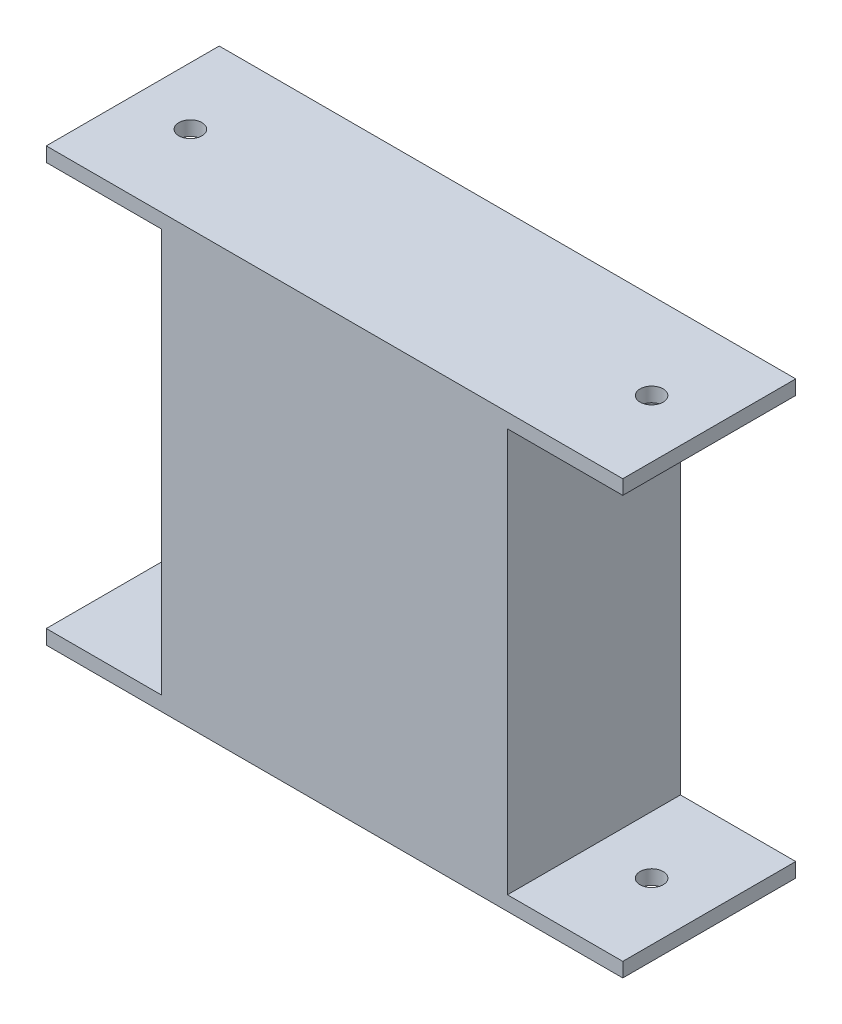
ISO-10303-21;
HEADER;
FILE_DESCRIPTION(('STEP AP214'),'2;1');
FILE_NAME('part.step','',(''),(''),'','','');
FILE_SCHEMA(('AUTOMOTIVE_DESIGN { 1 0 10303 214 1 1 1 1 }'));
ENDSEC;
DATA;
#1=APPLICATION_CONTEXT('core data for automotive mechanical design processes');
#2=APPLICATION_PROTOCOL_DEFINITION('international standard','automotive_design',2000,#1);
#3=PRODUCT_CONTEXT('',#1,'mechanical');
#4=PRODUCT('Part','Part','',(#3));
#5=PRODUCT_RELATED_PRODUCT_CATEGORY('part','',(#4));
#6=PRODUCT_DEFINITION_FORMATION('','',#4);
#7=PRODUCT_DEFINITION_CONTEXT('part definition',#1,'design');
#8=PRODUCT_DEFINITION('design','',#6,#7);
#9=PRODUCT_DEFINITION_SHAPE('','',#8);
#10=(LENGTH_UNIT() NAMED_UNIT(*) SI_UNIT(.MILLI.,.METRE.));
#11=(NAMED_UNIT(*) PLANE_ANGLE_UNIT() SI_UNIT($,.RADIAN.));
#12=(NAMED_UNIT(*) SI_UNIT($,.STERADIAN.) SOLID_ANGLE_UNIT());
#13=UNCERTAINTY_MEASURE_WITH_UNIT(LENGTH_MEASURE(1.E-05),#10,'distance_accuracy_value','');
#14=(GEOMETRIC_REPRESENTATION_CONTEXT(3) GLOBAL_UNCERTAINTY_ASSIGNED_CONTEXT((#13)) GLOBAL_UNIT_ASSIGNED_CONTEXT((#10,
#11,#12)) REPRESENTATION_CONTEXT('',''));
#15=CARTESIAN_POINT('',(0.,0.,0.));
#16=DIRECTION('',(0.,0.,1.));
#17=DIRECTION('',(1.,0.,0.));
#18=AXIS2_PLACEMENT_3D('',#15,#16,#17);
#19=CARTESIAN_POINT('',(100.,75.,60.));
#20=DIRECTION('',(-1.,0.,0.));
#21=DIRECTION('',(0.,0.,1.));
#22=AXIS2_PLACEMENT_3D('',#19,#20,#21);
#23=PLANE('',#22);
#24=DIRECTION('',(0.,1.,0.));
#25=VECTOR('',#24,1.);
#26=CARTESIAN_POINT('',(100.,75.,0.));
#27=LINE('',#26,#25);
#28=CARTESIAN_POINT('',(100.,70.,0.));
#29=VERTEX_POINT('',#28);
#30=CARTESIAN_POINT('',(100.,75.,0.));
#31=VERTEX_POINT('',#30);
#32=EDGE_CURVE('E165',#29,#31,#27,.T.);
#33=ORIENTED_EDGE('',*,*,#32,.T.);
#34=DIRECTION('',(0.,0.,-1.));
#35=VECTOR('',#34,1.);
#36=CARTESIAN_POINT('',(100.,75.,60.));
#37=LINE('',#36,#35);
#38=CARTESIAN_POINT('',(100.,75.,60.));
#39=VERTEX_POINT('',#38);
#40=EDGE_CURVE('E11',#39,#31,#37,.T.);
#41=ORIENTED_EDGE('',*,*,#40,.F.);
#42=DIRECTION('',(0.,1.,0.));
#43=VECTOR('',#42,1.);
#44=CARTESIAN_POINT('',(100.,75.,60.));
#45=LINE('',#44,#43);
#46=CARTESIAN_POINT('',(100.,70.,60.));
#47=VERTEX_POINT('',#46);
#48=EDGE_CURVE('E183',#47,#39,#45,.T.);
#49=ORIENTED_EDGE('',*,*,#48,.F.);
#50=DIRECTION('',(0.,0.,-1.));
#51=VECTOR('',#50,1.);
#52=CARTESIAN_POINT('',(100.,70.,60.));
#53=LINE('',#52,#51);
#54=EDGE_CURVE('E158',#47,#29,#53,.T.);
#55=ORIENTED_EDGE('',*,*,#54,.T.);
#56=EDGE_LOOP('',(#33,#41,#49,#55));
#57=FACE_BOUND('',#56,.T.);
#58=ADVANCED_FACE('F41',(#57),#23,.F.);
#59=CARTESIAN_POINT('',(-100.,75.,60.));
#60=DIRECTION('',(0.,-1.,0.));
#61=DIRECTION('',(0.,0.,-1.));
#62=AXIS2_PLACEMENT_3D('',#59,#60,#61);
#63=PLANE('',#62);
#64=CARTESIAN_POINT('',(-80.,75.,29.999999999999));
#65=DIRECTION('',(0.,-1.,0.));
#66=DIRECTION('',(0.,0.,-1.));
#67=AXIS2_PLACEMENT_3D('',#64,#65,#66);
#68=CIRCLE('',#67,4.00000000000001);
#69=CARTESIAN_POINT('',(-80.,75.,25.9999999999989));
#70=VERTEX_POINT('',#69);
#71=EDGE_CURVE('E167',#70,#70,#68,.T.);
#72=ORIENTED_EDGE('',*,*,#71,.T.);
#73=EDGE_LOOP('',(#72));
#74=FACE_BOUND('',#73,.T.);
#75=CARTESIAN_POINT('',(80.,75.,29.999999999999));
#76=DIRECTION('',(0.,-1.,0.));
#77=DIRECTION('',(0.,0.,-1.));
#78=AXIS2_PLACEMENT_3D('',#75,#76,#77);
#79=CIRCLE('',#78,4.00000000000001);
#80=CARTESIAN_POINT('',(80.,75.,25.9999999999989));
#81=VERTEX_POINT('',#80);
#82=EDGE_CURVE('E308',#81,#81,#79,.T.);
#83=ORIENTED_EDGE('',*,*,#82,.T.);
#84=EDGE_LOOP('',(#83));
#85=FACE_BOUND('',#84,.T.);
#86=DIRECTION('',(-1.,0.,0.));
#87=VECTOR('',#86,1.);
#88=CARTESIAN_POINT('',(-100.,75.,0.));
#89=LINE('',#88,#87);
#90=CARTESIAN_POINT('',(-100.,75.,0.));
#91=VERTEX_POINT('',#90);
#92=EDGE_CURVE('E164',#31,#91,#89,.T.);
#93=ORIENTED_EDGE('',*,*,#92,.T.);
#94=DIRECTION('',(0.,0.,-1.));
#95=VECTOR('',#94,1.);
#96=CARTESIAN_POINT('',(-100.,75.,60.));
#97=LINE('',#96,#95);
#98=CARTESIAN_POINT('',(-100.,75.,60.));
#99=VERTEX_POINT('',#98);
#100=EDGE_CURVE('E49',#99,#91,#97,.T.);
#101=ORIENTED_EDGE('',*,*,#100,.F.);
#102=DIRECTION('',(-1.,0.,0.));
#103=VECTOR('',#102,1.);
#104=CARTESIAN_POINT('',(-100.,75.,60.));
#105=LINE('',#104,#103);
#106=EDGE_CURVE('E114',#39,#99,#105,.T.);
#107=ORIENTED_EDGE('',*,*,#106,.F.);
#108=ORIENTED_EDGE('',*,*,#40,.T.);
#109=EDGE_LOOP('',(#93,#101,#107,#108));
#110=FACE_BOUND('',#109,.T.);
#111=ADVANCED_FACE('F268',(#74,#85,#110),#63,.F.);
#112=CARTESIAN_POINT('',(-100.,70.,60.));
#113=DIRECTION('',(1.,0.,0.));
#114=DIRECTION('',(0.,1.,0.));
#115=AXIS2_PLACEMENT_3D('',#112,#113,#114);
#116=PLANE('',#115);
#117=DIRECTION('',(0.,-1.,0.));
#118=VECTOR('',#117,1.);
#119=CARTESIAN_POINT('',(-100.,70.,0.));
#120=LINE('',#119,#118);
#121=CARTESIAN_POINT('',(-100.,70.,0.));
#122=VERTEX_POINT('',#121);
#123=EDGE_CURVE('E169',#91,#122,#120,.T.);
#124=ORIENTED_EDGE('',*,*,#123,.T.);
#125=DIRECTION('',(0.,0.,-1.));
#126=VECTOR('',#125,1.);
#127=CARTESIAN_POINT('',(-100.,70.,60.));
#128=LINE('',#127,#126);
#129=CARTESIAN_POINT('',(-100.,70.,60.));
#130=VERTEX_POINT('',#129);
#131=EDGE_CURVE('E204',#130,#122,#128,.T.);
#132=ORIENTED_EDGE('',*,*,#131,.F.);
#133=DIRECTION('',(0.,-1.,0.));
#134=VECTOR('',#133,1.);
#135=CARTESIAN_POINT('',(-100.,70.,60.));
#136=LINE('',#135,#134);
#137=EDGE_CURVE('E213',#99,#130,#136,.T.);
#138=ORIENTED_EDGE('',*,*,#137,.F.);
#139=ORIENTED_EDGE('',*,*,#100,.T.);
#140=EDGE_LOOP('',(#124,#132,#138,#139));
#141=FACE_BOUND('',#140,.T.);
#142=ADVANCED_FACE('F211',(#141),#116,.F.);
#143=CARTESIAN_POINT('',(-60.,70.,60.));
#144=DIRECTION('',(0.,1.,0.));
#145=DIRECTION('',(0.,0.,1.));
#146=AXIS2_PLACEMENT_3D('',#143,#144,#145);
#147=PLANE('',#146);
#148=CARTESIAN_POINT('',(-80.,70.,29.999999999999));
#149=DIRECTION('',(0.,1.,0.));
#150=DIRECTION('',(0.,0.,1.));
#151=AXIS2_PLACEMENT_3D('',#148,#149,#150);
#152=CIRCLE('',#151,4.00000000000001);
#153=CARTESIAN_POINT('',(-80.,70.,33.999999999999));
#154=VERTEX_POINT('',#153);
#155=EDGE_CURVE('E318',#154,#154,#152,.T.);
#156=ORIENTED_EDGE('',*,*,#155,.T.);
#157=EDGE_LOOP('',(#156));
#158=FACE_BOUND('',#157,.T.);
#159=DIRECTION('',(1.,0.,0.));
#160=VECTOR('',#159,1.);
#161=CARTESIAN_POINT('',(-60.,70.,0.));
#162=LINE('',#161,#160);
#163=CARTESIAN_POINT('',(-60.,70.,0.));
#164=VERTEX_POINT('',#163);
#165=EDGE_CURVE('E168',#122,#164,#162,.T.);
#166=ORIENTED_EDGE('',*,*,#165,.T.);
#167=DIRECTION('',(0.,0.,-1.));
#168=VECTOR('',#167,1.);
#169=CARTESIAN_POINT('',(-60.,70.,60.));
#170=LINE('',#169,#168);
#171=CARTESIAN_POINT('',(-60.,70.,60.));
#172=VERTEX_POINT('',#171);
#173=EDGE_CURVE('E203',#172,#164,#170,.T.);
#174=ORIENTED_EDGE('',*,*,#173,.F.);
#175=DIRECTION('',(1.,0.,0.));
#176=VECTOR('',#175,1.);
#177=CARTESIAN_POINT('',(-60.,70.,60.));
#178=LINE('',#177,#176);
#179=EDGE_CURVE('E232',#130,#172,#178,.T.);
#180=ORIENTED_EDGE('',*,*,#179,.F.);
#181=ORIENTED_EDGE('',*,*,#131,.T.);
#182=EDGE_LOOP('',(#166,#174,#180,#181));
#183=FACE_BOUND('',#182,.T.);
#184=ADVANCED_FACE('F225',(#158,#183),#147,.F.);
#185=CARTESIAN_POINT('',(-60.,-70.,60.));
#186=DIRECTION('',(1.,0.,0.));
#187=DIRECTION('',(0.,0.,-1.));
#188=AXIS2_PLACEMENT_3D('',#185,#186,#187);
#189=PLANE('',#188);
#190=DIRECTION('',(0.,-1.,0.));
#191=VECTOR('',#190,1.);
#192=CARTESIAN_POINT('',(-60.,-70.,0.));
#193=LINE('',#192,#191);
#194=CARTESIAN_POINT('',(-60.,-70.,0.));
#195=VERTEX_POINT('',#194);
#196=EDGE_CURVE('E175',#164,#195,#193,.T.);
#197=ORIENTED_EDGE('',*,*,#196,.T.);
#198=DIRECTION('',(0.,0.,-1.));
#199=VECTOR('',#198,1.);
#200=CARTESIAN_POINT('',(-60.,-70.,60.));
#201=LINE('',#200,#199);
#202=CARTESIAN_POINT('',(-60.,-70.,60.));
#203=VERTEX_POINT('',#202);
#204=EDGE_CURVE('E196',#203,#195,#201,.T.);
#205=ORIENTED_EDGE('',*,*,#204,.F.);
#206=DIRECTION('',(0.,-1.,0.));
#207=VECTOR('',#206,1.);
#208=CARTESIAN_POINT('',(-60.,-70.,60.));
#209=LINE('',#208,#207);
#210=EDGE_CURVE('E226',#172,#203,#209,.T.);
#211=ORIENTED_EDGE('',*,*,#210,.F.);
#212=ORIENTED_EDGE('',*,*,#173,.T.);
#213=EDGE_LOOP('',(#197,#205,#211,#212));
#214=FACE_BOUND('',#213,.T.);
#215=ADVANCED_FACE('F228',(#214),#189,.F.);
#216=CARTESIAN_POINT('',(-100.,-70.,60.));
#217=DIRECTION('',(0.,-1.,0.));
#218=DIRECTION('',(0.,0.,-1.));
#219=AXIS2_PLACEMENT_3D('',#216,#217,#218);
#220=PLANE('',#219);
#221=CARTESIAN_POINT('',(-80.,-70.,30.));
#222=DIRECTION('',(0.,-1.,0.));
#223=DIRECTION('',(0.,0.,-1.));
#224=AXIS2_PLACEMENT_3D('',#221,#222,#223);
#225=CIRCLE('',#224,4.00000000000001);
#226=CARTESIAN_POINT('',(-80.,-70.,26.));
#227=VERTEX_POINT('',#226);
#228=EDGE_CURVE('E310',#227,#227,#225,.T.);
#229=ORIENTED_EDGE('',*,*,#228,.T.);
#230=EDGE_LOOP('',(#229));
#231=FACE_BOUND('',#230,.T.);
#232=DIRECTION('',(-1.,0.,0.));
#233=VECTOR('',#232,1.);
#234=CARTESIAN_POINT('',(-100.,-70.,0.));
#235=LINE('',#234,#233);
#236=CARTESIAN_POINT('',(-100.,-70.,0.));
#237=VERTEX_POINT('',#236);
#238=EDGE_CURVE('E174',#195,#237,#235,.T.);
#239=ORIENTED_EDGE('',*,*,#238,.T.);
#240=DIRECTION('',(0.,0.,-1.));
#241=VECTOR('',#240,1.);
#242=CARTESIAN_POINT('',(-100.,-70.,60.));
#243=LINE('',#242,#241);
#244=CARTESIAN_POINT('',(-100.,-70.,60.));
#245=VERTEX_POINT('',#244);
#246=EDGE_CURVE('E191',#245,#237,#243,.T.);
#247=ORIENTED_EDGE('',*,*,#246,.F.);
#248=DIRECTION('',(-1.,0.,0.));
#249=VECTOR('',#248,1.);
#250=CARTESIAN_POINT('',(-100.,-70.,60.));
#251=LINE('',#250,#249);
#252=EDGE_CURVE('E227',#203,#245,#251,.T.);
#253=ORIENTED_EDGE('',*,*,#252,.F.);
#254=ORIENTED_EDGE('',*,*,#204,.T.);
#255=EDGE_LOOP('',(#239,#247,#253,#254));
#256=FACE_BOUND('',#255,.T.);
#257=ADVANCED_FACE('F287',(#231,#256),#220,.F.);
#258=CARTESIAN_POINT('',(-100.,-75.,60.));
#259=DIRECTION('',(1.,0.,0.));
#260=DIRECTION('',(0.,1.,0.));
#261=AXIS2_PLACEMENT_3D('',#258,#259,#260);
#262=PLANE('',#261);
#263=DIRECTION('',(0.,-1.,0.));
#264=VECTOR('',#263,1.);
#265=CARTESIAN_POINT('',(-100.,-75.,0.));
#266=LINE('',#265,#264);
#267=CARTESIAN_POINT('',(-100.,-75.,0.));
#268=VERTEX_POINT('',#267);
#269=EDGE_CURVE('E177',#237,#268,#266,.T.);
#270=ORIENTED_EDGE('',*,*,#269,.T.);
#271=DIRECTION('',(0.,0.,-1.));
#272=VECTOR('',#271,1.);
#273=CARTESIAN_POINT('',(-100.,-75.,60.));
#274=LINE('',#273,#272);
#275=CARTESIAN_POINT('',(-100.,-75.,60.));
#276=VERTEX_POINT('',#275);
#277=EDGE_CURVE('E195',#276,#268,#274,.T.);
#278=ORIENTED_EDGE('',*,*,#277,.F.);
#279=DIRECTION('',(0.,-1.,0.));
#280=VECTOR('',#279,1.);
#281=CARTESIAN_POINT('',(-100.,-75.,60.));
#282=LINE('',#281,#280);
#283=EDGE_CURVE('E233',#245,#276,#282,.T.);
#284=ORIENTED_EDGE('',*,*,#283,.F.);
#285=ORIENTED_EDGE('',*,*,#246,.T.);
#286=EDGE_LOOP('',(#270,#278,#284,#285));
#287=FACE_BOUND('',#286,.T.);
#288=ADVANCED_FACE('F289',(#287),#262,.F.);
#289=CARTESIAN_POINT('',(100.,-75.,60.));
#290=DIRECTION('',(0.,1.,0.));
#291=DIRECTION('',(0.,0.,1.));
#292=AXIS2_PLACEMENT_3D('',#289,#290,#291);
#293=PLANE('',#292);
#294=CARTESIAN_POINT('',(-80.,-75.,30.));
#295=DIRECTION('',(0.,-1.,0.));
#296=DIRECTION('',(0.,0.,-1.));
#297=AXIS2_PLACEMENT_3D('',#294,#295,#296);
#298=CIRCLE('',#297,4.00000000000001);
#299=CARTESIAN_POINT('',(-80.,-75.,26.));
#300=VERTEX_POINT('',#299);
#301=EDGE_CURVE('E313',#300,#300,#298,.T.);
#302=ORIENTED_EDGE('',*,*,#301,.F.);
#303=EDGE_LOOP('',(#302));
#304=FACE_BOUND('',#303,.T.);
#305=CARTESIAN_POINT('',(80.,-75.,30.));
#306=DIRECTION('',(0.,-1.,0.));
#307=DIRECTION('',(0.,0.,1.));
#308=AXIS2_PLACEMENT_3D('',#305,#306,#307);
#309=CIRCLE('',#308,4.00000000000001);
#310=CARTESIAN_POINT('',(80.,-75.,34.));
#311=VERTEX_POINT('',#310);
#312=EDGE_CURVE('E311',#311,#311,#309,.T.);
#313=ORIENTED_EDGE('',*,*,#312,.F.);
#314=EDGE_LOOP('',(#313));
#315=FACE_BOUND('',#314,.T.);
#316=DIRECTION('',(1.,0.,0.));
#317=VECTOR('',#316,1.);
#318=CARTESIAN_POINT('',(100.,-75.,0.));
#319=LINE('',#318,#317);
#320=CARTESIAN_POINT('',(100.,-75.,0.));
#321=VERTEX_POINT('',#320);
#322=EDGE_CURVE('E178',#268,#321,#319,.T.);
#323=ORIENTED_EDGE('',*,*,#322,.T.);
#324=DIRECTION('',(0.,0.,-1.));
#325=VECTOR('',#324,1.);
#326=CARTESIAN_POINT('',(100.,-75.,60.));
#327=LINE('',#326,#325);
#328=CARTESIAN_POINT('',(100.,-75.,60.));
#329=VERTEX_POINT('',#328);
#330=EDGE_CURVE('E189',#329,#321,#327,.T.);
#331=ORIENTED_EDGE('',*,*,#330,.F.);
#332=DIRECTION('',(1.,0.,0.));
#333=VECTOR('',#332,1.);
#334=CARTESIAN_POINT('',(100.,-75.,60.));
#335=LINE('',#334,#333);
#336=EDGE_CURVE('E239',#276,#329,#335,.T.);
#337=ORIENTED_EDGE('',*,*,#336,.F.);
#338=ORIENTED_EDGE('',*,*,#277,.T.);
#339=EDGE_LOOP('',(#323,#331,#337,#338));
#340=FACE_BOUND('',#339,.T.);
#341=ADVANCED_FACE('F242',(#304,#315,#340),#293,.F.);
#342=CARTESIAN_POINT('',(100.,-70.,60.));
#343=DIRECTION('',(-1.,0.,0.));
#344=DIRECTION('',(0.,0.,1.));
#345=AXIS2_PLACEMENT_3D('',#342,#343,#344);
#346=PLANE('',#345);
#347=DIRECTION('',(0.,1.,0.));
#348=VECTOR('',#347,1.);
#349=CARTESIAN_POINT('',(100.,-70.,0.));
#350=LINE('',#349,#348);
#351=CARTESIAN_POINT('',(100.,-70.,0.));
#352=VERTEX_POINT('',#351);
#353=EDGE_CURVE('E176',#321,#352,#350,.T.);
#354=ORIENTED_EDGE('',*,*,#353,.T.);
#355=DIRECTION('',(0.,0.,-1.));
#356=VECTOR('',#355,1.);
#357=CARTESIAN_POINT('',(100.,-70.,60.));
#358=LINE('',#357,#356);
#359=CARTESIAN_POINT('',(100.,-70.,60.));
#360=VERTEX_POINT('',#359);
#361=EDGE_CURVE('E153',#360,#352,#358,.T.);
#362=ORIENTED_EDGE('',*,*,#361,.F.);
#363=DIRECTION('',(0.,1.,0.));
#364=VECTOR('',#363,1.);
#365=CARTESIAN_POINT('',(100.,-70.,60.));
#366=LINE('',#365,#364);
#367=EDGE_CURVE('E145',#329,#360,#366,.T.);
#368=ORIENTED_EDGE('',*,*,#367,.F.);
#369=ORIENTED_EDGE('',*,*,#330,.T.);
#370=EDGE_LOOP('',(#354,#362,#368,#369));
#371=FACE_BOUND('',#370,.T.);
#372=ADVANCED_FACE('F249',(#371),#346,.F.);
#373=CARTESIAN_POINT('',(60.,-70.,60.));
#374=DIRECTION('',(0.,-1.,0.));
#375=DIRECTION('',(0.,0.,-1.));
#376=AXIS2_PLACEMENT_3D('',#373,#374,#375);
#377=PLANE('',#376);
#378=CARTESIAN_POINT('',(80.,-70.,30.));
#379=DIRECTION('',(0.,-1.,0.));
#380=DIRECTION('',(0.,0.,-1.));
#381=AXIS2_PLACEMENT_3D('',#378,#379,#380);
#382=CIRCLE('',#381,4.00000000000001);
#383=CARTESIAN_POINT('',(80.,-70.,26.));
#384=VERTEX_POINT('',#383);
#385=EDGE_CURVE('E304',#384,#384,#382,.T.);
#386=ORIENTED_EDGE('',*,*,#385,.T.);
#387=EDGE_LOOP('',(#386));
#388=FACE_BOUND('',#387,.T.);
#389=DIRECTION('',(-1.,0.,0.));
#390=VECTOR('',#389,1.);
#391=CARTESIAN_POINT('',(60.,-70.,0.));
#392=LINE('',#391,#390);
#393=CARTESIAN_POINT('',(60.,-70.,0.));
#394=VERTEX_POINT('',#393);
#395=EDGE_CURVE('E155',#352,#394,#392,.T.);
#396=ORIENTED_EDGE('',*,*,#395,.T.);
#397=DIRECTION('',(0.,0.,-1.));
#398=VECTOR('',#397,1.);
#399=CARTESIAN_POINT('',(60.,-70.,60.));
#400=LINE('',#399,#398);
#401=CARTESIAN_POINT('',(60.,-70.,60.));
#402=VERTEX_POINT('',#401);
#403=EDGE_CURVE('E149',#402,#394,#400,.T.);
#404=ORIENTED_EDGE('',*,*,#403,.F.);
#405=DIRECTION('',(-1.,0.,0.));
#406=VECTOR('',#405,1.);
#407=CARTESIAN_POINT('',(60.,-70.,60.));
#408=LINE('',#407,#406);
#409=EDGE_CURVE('E138',#360,#402,#408,.T.);
#410=ORIENTED_EDGE('',*,*,#409,.F.);
#411=ORIENTED_EDGE('',*,*,#361,.T.);
#412=EDGE_LOOP('',(#396,#404,#410,#411));
#413=FACE_BOUND('',#412,.T.);
#414=ADVANCED_FACE('F147',(#388,#413),#377,.F.);
#415=CARTESIAN_POINT('',(60.,70.,60.));
#416=DIRECTION('',(-1.,0.,0.));
#417=DIRECTION('',(0.,0.,1.));
#418=AXIS2_PLACEMENT_3D('',#415,#416,#417);
#419=PLANE('',#418);
#420=DIRECTION('',(0.,1.,0.));
#421=VECTOR('',#420,1.);
#422=CARTESIAN_POINT('',(60.,70.,0.));
#423=LINE('',#422,#421);
#424=CARTESIAN_POINT('',(60.,70.,0.));
#425=VERTEX_POINT('',#424);
#426=EDGE_CURVE('E97',#394,#425,#423,.T.);
#427=ORIENTED_EDGE('',*,*,#426,.T.);
#428=DIRECTION('',(0.,0.,-1.));
#429=VECTOR('',#428,1.);
#430=CARTESIAN_POINT('',(60.,70.,60.));
#431=LINE('',#430,#429);
#432=CARTESIAN_POINT('',(60.,70.,60.));
#433=VERTEX_POINT('',#432);
#434=EDGE_CURVE('E152',#433,#425,#431,.T.);
#435=ORIENTED_EDGE('',*,*,#434,.F.);
#436=DIRECTION('',(0.,1.,0.));
#437=VECTOR('',#436,1.);
#438=CARTESIAN_POINT('',(60.,70.,60.));
#439=LINE('',#438,#437);
#440=EDGE_CURVE('E142',#402,#433,#439,.T.);
#441=ORIENTED_EDGE('',*,*,#440,.F.);
#442=ORIENTED_EDGE('',*,*,#403,.T.);
#443=EDGE_LOOP('',(#427,#435,#441,#442));
#444=FACE_BOUND('',#443,.T.);
#445=ADVANCED_FACE('F156',(#444),#419,.F.);
#446=CARTESIAN_POINT('',(100.,70.,60.));
#447=DIRECTION('',(0.,1.,0.));
#448=DIRECTION('',(0.,0.,1.));
#449=AXIS2_PLACEMENT_3D('',#446,#447,#448);
#450=PLANE('',#449);
#451=CARTESIAN_POINT('',(80.,70.,29.999999999999));
#452=DIRECTION('',(0.,1.,0.));
#453=DIRECTION('',(0.,0.,1.));
#454=AXIS2_PLACEMENT_3D('',#451,#452,#453);
#455=CIRCLE('',#454,4.00000000000001);
#456=CARTESIAN_POINT('',(80.,70.,33.999999999999));
#457=VERTEX_POINT('',#456);
#458=EDGE_CURVE('E42',#457,#457,#455,.T.);
#459=ORIENTED_EDGE('',*,*,#458,.T.);
#460=EDGE_LOOP('',(#459));
#461=FACE_BOUND('',#460,.T.);
#462=DIRECTION('',(1.,0.,0.));
#463=VECTOR('',#462,1.);
#464=CARTESIAN_POINT('',(100.,70.,0.));
#465=LINE('',#464,#463);
#466=EDGE_CURVE('E104',#425,#29,#465,.T.);
#467=ORIENTED_EDGE('',*,*,#466,.T.);
#468=ORIENTED_EDGE('',*,*,#54,.F.);
#469=DIRECTION('',(1.,0.,0.));
#470=VECTOR('',#469,1.);
#471=CARTESIAN_POINT('',(100.,70.,60.));
#472=LINE('',#471,#470);
#473=EDGE_CURVE('E59',#433,#47,#472,.T.);
#474=ORIENTED_EDGE('',*,*,#473,.F.);
#475=ORIENTED_EDGE('',*,*,#434,.T.);
#476=EDGE_LOOP('',(#467,#468,#474,#475));
#477=FACE_BOUND('',#476,.T.);
#478=ADVANCED_FACE('F251',(#461,#477),#450,.F.);
#479=CARTESIAN_POINT('',(0.,0.,60.));
#480=DIRECTION('',(0.,0.,-1.));
#481=DIRECTION('',(-1.,0.,0.));
#482=AXIS2_PLACEMENT_3D('',#479,#480,#481);
#483=PLANE('',#482);
#484=ORIENTED_EDGE('',*,*,#48,.T.);
#485=ORIENTED_EDGE('',*,*,#106,.T.);
#486=ORIENTED_EDGE('',*,*,#137,.T.);
#487=ORIENTED_EDGE('',*,*,#179,.T.);
#488=ORIENTED_EDGE('',*,*,#210,.T.);
#489=ORIENTED_EDGE('',*,*,#252,.T.);
#490=ORIENTED_EDGE('',*,*,#283,.T.);
#491=ORIENTED_EDGE('',*,*,#336,.T.);
#492=ORIENTED_EDGE('',*,*,#367,.T.);
#493=ORIENTED_EDGE('',*,*,#409,.T.);
#494=ORIENTED_EDGE('',*,*,#440,.T.);
#495=ORIENTED_EDGE('',*,*,#473,.T.);
#496=EDGE_LOOP('',(#484,#485,#486,#487,#488,#489,#490,#491,#492,#493,#494,#495));
#497=FACE_BOUND('',#496,.T.);
#498=ADVANCED_FACE('F136',(#497),#483,.F.);
#499=CARTESIAN_POINT('',(0.,0.,0.));
#500=DIRECTION('',(0.,0.,-1.));
#501=DIRECTION('',(-1.,0.,0.));
#502=AXIS2_PLACEMENT_3D('',#499,#500,#501);
#503=PLANE('',#502);
#504=ORIENTED_EDGE('',*,*,#32,.F.);
#505=ORIENTED_EDGE('',*,*,#466,.F.);
#506=ORIENTED_EDGE('',*,*,#426,.F.);
#507=ORIENTED_EDGE('',*,*,#395,.F.);
#508=ORIENTED_EDGE('',*,*,#353,.F.);
#509=ORIENTED_EDGE('',*,*,#322,.F.);
#510=ORIENTED_EDGE('',*,*,#269,.F.);
#511=ORIENTED_EDGE('',*,*,#238,.F.);
#512=ORIENTED_EDGE('',*,*,#196,.F.);
#513=ORIENTED_EDGE('',*,*,#165,.F.);
#514=ORIENTED_EDGE('',*,*,#123,.F.);
#515=ORIENTED_EDGE('',*,*,#92,.F.);
#516=EDGE_LOOP('',(#504,#505,#506,#507,#508,#509,#510,#511,#512,#513,#514,#515));
#517=FACE_BOUND('',#516,.T.);
#518=ADVANCED_FACE('F220',(#517),#503,.T.);
#519=CARTESIAN_POINT('',(80.,123.,29.9999999999986));
#520=DIRECTION('',(0.,-1.,0.));
#521=DIRECTION('',(0.,0.,-1.));
#522=AXIS2_PLACEMENT_3D('',#519,#520,#521);
#523=CYLINDRICAL_SURFACE('',#522,4.00000000000001);
#524=ORIENTED_EDGE('',*,*,#458,.F.);
#525=EDGE_LOOP('',(#524));
#526=FACE_BOUND('',#525,.T.);
#527=ORIENTED_EDGE('',*,*,#82,.F.);
#528=EDGE_LOOP('',(#527));
#529=FACE_BOUND('',#528,.T.);
#530=ADVANCED_FACE('F340',(#526,#529),#523,.F.);
#531=ORIENTED_EDGE('',*,*,#312,.T.);
#532=EDGE_LOOP('',(#531));
#533=FACE_BOUND('',#532,.T.);
#534=ORIENTED_EDGE('',*,*,#385,.F.);
#535=EDGE_LOOP('',(#534));
#536=FACE_BOUND('',#535,.T.);
#537=ADVANCED_FACE('F334',(#533,#536),#523,.F.);
#538=CARTESIAN_POINT('',(-80.,123.,29.9999999999986));
#539=DIRECTION('',(0.,-1.,0.));
#540=DIRECTION('',(0.,0.,-1.));
#541=AXIS2_PLACEMENT_3D('',#538,#539,#540);
#542=CYLINDRICAL_SURFACE('',#541,4.00000000000001);
#543=ORIENTED_EDGE('',*,*,#301,.T.);
#544=EDGE_LOOP('',(#543));
#545=FACE_BOUND('',#544,.T.);
#546=ORIENTED_EDGE('',*,*,#228,.F.);
#547=EDGE_LOOP('',(#546));
#548=FACE_BOUND('',#547,.T.);
#549=ADVANCED_FACE('F330',(#545,#548),#542,.F.);
#550=ORIENTED_EDGE('',*,*,#155,.F.);
#551=EDGE_LOOP('',(#550));
#552=FACE_BOUND('',#551,.T.);
#553=ORIENTED_EDGE('',*,*,#71,.F.);
#554=EDGE_LOOP('',(#553));
#555=FACE_BOUND('',#554,.T.);
#556=ADVANCED_FACE('F324',(#552,#555),#542,.F.);
#557=CLOSED_SHELL('',(#58,#111,#142,#184,#215,#257,#288,#341,#372,#414,#445,#478,#498,#518,#530,
#537,#549,#556));
#558=MANIFOLD_SOLID_BREP('B2',#557);
#559=ADVANCED_BREP_SHAPE_REPRESENTATION('',(#18,#558),#14);
#560=SHAPE_DEFINITION_REPRESENTATION(#9,#559);
ENDSEC;
END-ISO-10303-21;
